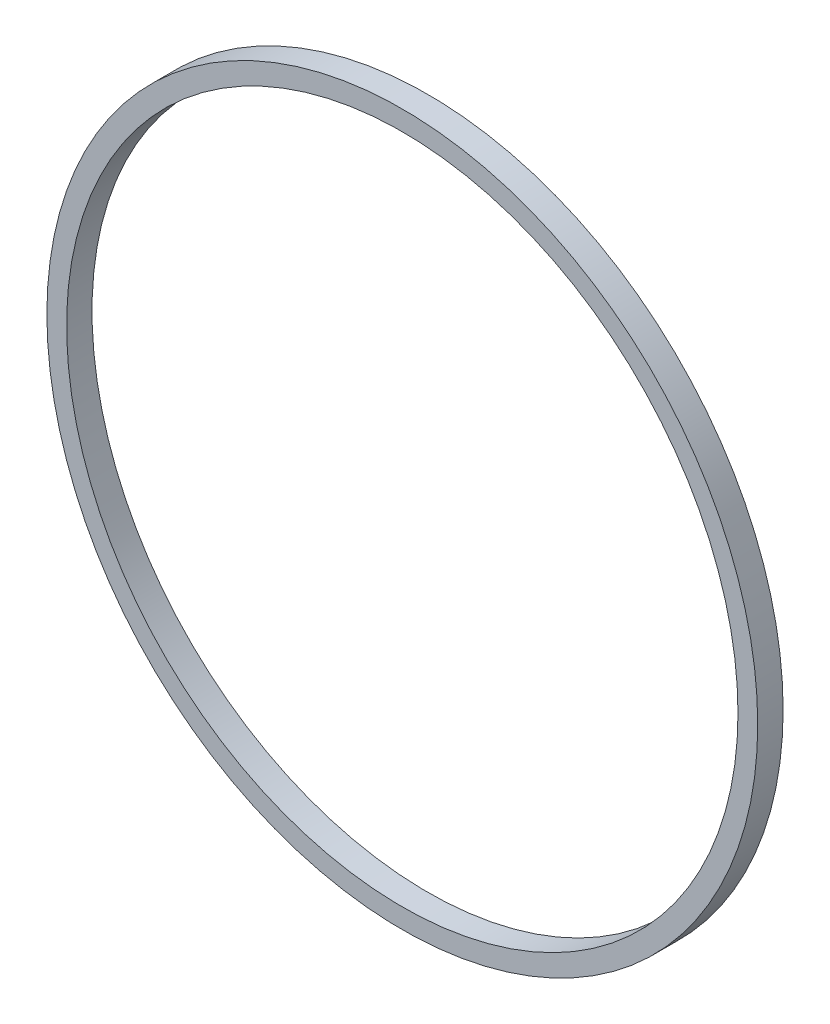
ISO-10303-21;
HEADER;
FILE_DESCRIPTION(('STEP AP214'),'2;1');
FILE_NAME('part.step','',(''),(''),'','','');
FILE_SCHEMA(('AUTOMOTIVE_DESIGN { 1 0 10303 214 1 1 1 1 }'));
ENDSEC;
DATA;
#1=APPLICATION_CONTEXT('core data for automotive mechanical design processes');
#2=APPLICATION_PROTOCOL_DEFINITION('international standard','automotive_design',2000,#1);
#3=PRODUCT_CONTEXT('',#1,'mechanical');
#4=PRODUCT('Part','Part','',(#3));
#5=PRODUCT_RELATED_PRODUCT_CATEGORY('part','',(#4));
#6=PRODUCT_DEFINITION_FORMATION('','',#4);
#7=PRODUCT_DEFINITION_CONTEXT('part definition',#1,'design');
#8=PRODUCT_DEFINITION('design','',#6,#7);
#9=PRODUCT_DEFINITION_SHAPE('','',#8);
#10=(LENGTH_UNIT() NAMED_UNIT(*) SI_UNIT(.MILLI.,.METRE.));
#11=(NAMED_UNIT(*) PLANE_ANGLE_UNIT() SI_UNIT($,.RADIAN.));
#12=(NAMED_UNIT(*) SI_UNIT($,.STERADIAN.) SOLID_ANGLE_UNIT());
#13=UNCERTAINTY_MEASURE_WITH_UNIT(LENGTH_MEASURE(1.E-05),#10,'distance_accuracy_value','');
#14=(GEOMETRIC_REPRESENTATION_CONTEXT(3) GLOBAL_UNCERTAINTY_ASSIGNED_CONTEXT((#13)) GLOBAL_UNIT_ASSIGNED_CONTEXT((#10,
#11,#12)) REPRESENTATION_CONTEXT('',''));
#15=CARTESIAN_POINT('',(0.,0.,0.));
#16=DIRECTION('',(0.,0.,1.));
#17=DIRECTION('',(1.,0.,0.));
#18=AXIS2_PLACEMENT_3D('',#15,#16,#17);
#19=CARTESIAN_POINT('',(57.8749505170549,92.2544483756481,2.25));
#20=DIRECTION('',(0.,0.,-1.));
#21=DIRECTION('',(-1.,0.,0.));
#22=AXIS2_PLACEMENT_3D('',#19,#20,#21);
#23=CYLINDRICAL_SURFACE('',#22,59.5);
#24=CARTESIAN_POINT('',(57.8749505170549,92.2544483756481,2.25));
#25=DIRECTION('',(0.,0.,1.));
#26=DIRECTION('',(1.,0.,0.));
#27=AXIS2_PLACEMENT_3D('',#24,#25,#26);
#28=CIRCLE('',#27,59.5);
#29=CARTESIAN_POINT('',(117.374950517055,92.2544483756481,2.25));
#30=VERTEX_POINT('',#29);
#31=EDGE_CURVE('E41',#30,#30,#28,.T.);
#32=ORIENTED_EDGE('',*,*,#31,.T.);
#33=EDGE_LOOP('',(#32));
#34=FACE_BOUND('',#33,.T.);
#35=CARTESIAN_POINT('',(57.8749505170549,92.2544483756481,-2.25));
#36=DIRECTION('',(0.,0.,1.));
#37=DIRECTION('',(1.,0.,0.));
#38=AXIS2_PLACEMENT_3D('',#35,#36,#37);
#39=CIRCLE('',#38,59.5);
#40=CARTESIAN_POINT('',(117.374950517055,92.2544483756481,-2.25));
#41=VERTEX_POINT('',#40);
#42=EDGE_CURVE('E47',#41,#41,#39,.T.);
#43=ORIENTED_EDGE('',*,*,#42,.F.);
#44=EDGE_LOOP('',(#43));
#45=FACE_BOUND('',#44,.T.);
#46=ADVANCED_FACE('F34',(#34,#45),#23,.F.);
#47=CARTESIAN_POINT('',(57.8749505170549,92.2544483756481,2.25));
#48=DIRECTION('',(0.,0.,-1.));
#49=DIRECTION('',(-1.,0.,0.));
#50=AXIS2_PLACEMENT_3D('',#47,#48,#49);
#51=CYLINDRICAL_SURFACE('',#50,63.);
#52=CARTESIAN_POINT('',(57.8749505170549,92.2544483756481,2.25));
#53=DIRECTION('',(0.,0.,1.));
#54=DIRECTION('',(1.,0.,0.));
#55=AXIS2_PLACEMENT_3D('',#52,#53,#54);
#56=CIRCLE('',#55,63.);
#57=CARTESIAN_POINT('',(120.874950517055,92.2544483756481,2.25));
#58=VERTEX_POINT('',#57);
#59=EDGE_CURVE('E10',#58,#58,#56,.T.);
#60=ORIENTED_EDGE('',*,*,#59,.F.);
#61=EDGE_LOOP('',(#60));
#62=FACE_BOUND('',#61,.T.);
#63=CARTESIAN_POINT('',(57.8749505170549,92.2544483756481,-2.25));
#64=DIRECTION('',(0.,0.,1.));
#65=DIRECTION('',(1.,0.,0.));
#66=AXIS2_PLACEMENT_3D('',#63,#64,#65);
#67=CIRCLE('',#66,63.);
#68=CARTESIAN_POINT('',(120.874950517055,92.2544483756481,-2.25));
#69=VERTEX_POINT('',#68);
#70=EDGE_CURVE('E37',#69,#69,#67,.T.);
#71=ORIENTED_EDGE('',*,*,#70,.T.);
#72=EDGE_LOOP('',(#71));
#73=FACE_BOUND('',#72,.T.);
#74=ADVANCED_FACE('F54',(#62,#73),#51,.T.);
#75=CARTESIAN_POINT('',(0.,0.,2.25));
#76=DIRECTION('',(0.,0.,1.));
#77=DIRECTION('',(1.,0.,0.));
#78=AXIS2_PLACEMENT_3D('',#75,#76,#77);
#79=PLANE('',#78);
#80=ORIENTED_EDGE('',*,*,#31,.F.);
#81=EDGE_LOOP('',(#80));
#82=FACE_BOUND('',#81,.T.);
#83=ORIENTED_EDGE('',*,*,#59,.T.);
#84=EDGE_LOOP('',(#83));
#85=FACE_BOUND('',#84,.T.);
#86=ADVANCED_FACE('F58',(#82,#85),#79,.T.);
#87=CARTESIAN_POINT('',(0.,0.,-2.25));
#88=DIRECTION('',(0.,0.,1.));
#89=DIRECTION('',(1.,0.,0.));
#90=AXIS2_PLACEMENT_3D('',#87,#88,#89);
#91=PLANE('',#90);
#92=ORIENTED_EDGE('',*,*,#42,.T.);
#93=EDGE_LOOP('',(#92));
#94=FACE_BOUND('',#93,.T.);
#95=ORIENTED_EDGE('',*,*,#70,.F.);
#96=EDGE_LOOP('',(#95));
#97=FACE_BOUND('',#96,.T.);
#98=ADVANCED_FACE('F56',(#94,#97),#91,.F.);
#99=CLOSED_SHELL('',(#46,#74,#86,#98));
#100=MANIFOLD_SOLID_BREP('B2',#99);
#101=ADVANCED_BREP_SHAPE_REPRESENTATION('',(#18,#100),#14);
#102=SHAPE_DEFINITION_REPRESENTATION(#9,#101);
ENDSEC;
END-ISO-10303-21;
